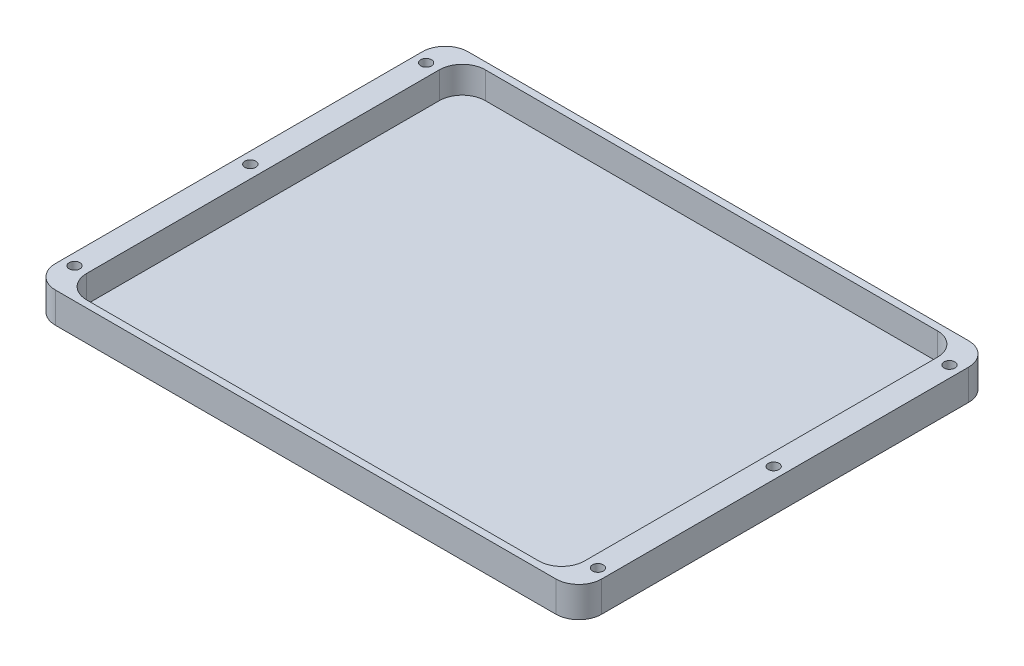
ISO-10303-21;
HEADER;
FILE_DESCRIPTION(('STEP AP214'),'2;1');
FILE_NAME('part.step','',(''),(''),'','','');
FILE_SCHEMA(('AUTOMOTIVE_DESIGN { 1 0 10303 214 1 1 1 1 }'));
ENDSEC;
DATA;
#1=APPLICATION_CONTEXT('core data for automotive mechanical design processes');
#2=APPLICATION_PROTOCOL_DEFINITION('international standard','automotive_design',2000,#1);
#3=PRODUCT_CONTEXT('',#1,'mechanical');
#4=PRODUCT('Part','Part','',(#3));
#5=PRODUCT_RELATED_PRODUCT_CATEGORY('part','',(#4));
#6=PRODUCT_DEFINITION_FORMATION('','',#4);
#7=PRODUCT_DEFINITION_CONTEXT('part definition',#1,'design');
#8=PRODUCT_DEFINITION('design','',#6,#7);
#9=PRODUCT_DEFINITION_SHAPE('','',#8);
#10=(LENGTH_UNIT() NAMED_UNIT(*) SI_UNIT(.MILLI.,.METRE.));
#11=(NAMED_UNIT(*) PLANE_ANGLE_UNIT() SI_UNIT($,.RADIAN.));
#12=(NAMED_UNIT(*) SI_UNIT($,.STERADIAN.) SOLID_ANGLE_UNIT());
#13=UNCERTAINTY_MEASURE_WITH_UNIT(LENGTH_MEASURE(1.E-05),#10,'distance_accuracy_value','');
#14=(GEOMETRIC_REPRESENTATION_CONTEXT(3) GLOBAL_UNCERTAINTY_ASSIGNED_CONTEXT((#13)) GLOBAL_UNIT_ASSIGNED_CONTEXT((#10,
#11,#12)) REPRESENTATION_CONTEXT('',''));
#15=CARTESIAN_POINT('',(0.,0.,0.));
#16=DIRECTION('',(0.,0.,1.));
#17=DIRECTION('',(1.,0.,0.));
#18=AXIS2_PLACEMENT_3D('',#15,#16,#17);
#19=CARTESIAN_POINT('',(0.,12.7,0.));
#20=DIRECTION('',(1.,0.,0.));
#21=DIRECTION('',(0.,0.,-1.));
#22=AXIS2_PLACEMENT_3D('',#19,#20,#21);
#23=PLANE('',#22);
#24=DIRECTION('',(0.,0.,1.));
#25=VECTOR('',#24,1.);
#26=CARTESIAN_POINT('',(0.,12.7,0.));
#27=LINE('',#26,#25);
#28=CARTESIAN_POINT('',(0.,12.7,-161.925));
#29=VERTEX_POINT('',#28);
#30=CARTESIAN_POINT('',(0.,12.7,-9.525));
#31=VERTEX_POINT('',#30);
#32=EDGE_CURVE('E223',#29,#31,#27,.T.);
#33=ORIENTED_EDGE('',*,*,#32,.F.);
#34=DIRECTION('',(0.,-1.,0.));
#35=VECTOR('',#34,1.);
#36=CARTESIAN_POINT('',(0.,12.7,-161.925));
#37=LINE('',#36,#35);
#38=CARTESIAN_POINT('',(0.,0.,-161.925));
#39=VERTEX_POINT('',#38);
#40=EDGE_CURVE('E245',#29,#39,#37,.T.);
#41=ORIENTED_EDGE('',*,*,#40,.T.);
#42=DIRECTION('',(0.,0.,1.));
#43=VECTOR('',#42,1.);
#44=CARTESIAN_POINT('',(0.,0.,0.));
#45=LINE('',#44,#43);
#46=CARTESIAN_POINT('',(0.,0.,-9.525));
#47=VERTEX_POINT('',#46);
#48=EDGE_CURVE('E211',#39,#47,#45,.T.);
#49=ORIENTED_EDGE('',*,*,#48,.T.);
#50=DIRECTION('',(0.,-1.,0.));
#51=VECTOR('',#50,1.);
#52=CARTESIAN_POINT('',(0.,12.7,-9.525));
#53=LINE('',#52,#51);
#54=EDGE_CURVE('E234',#47,#31,#53,.F.);
#55=ORIENTED_EDGE('',*,*,#54,.T.);
#56=EDGE_LOOP('',(#33,#41,#49,#55));
#57=FACE_BOUND('',#56,.T.);
#58=ADVANCED_FACE('F31',(#57),#23,.F.);
#59=CARTESIAN_POINT('',(0.,12.7,0.));
#60=DIRECTION('',(0.,0.,-1.));
#61=DIRECTION('',(-1.,0.,0.));
#62=AXIS2_PLACEMENT_3D('',#59,#60,#61);
#63=PLANE('',#62);
#64=DIRECTION('',(1.,0.,0.));
#65=VECTOR('',#64,1.);
#66=CARTESIAN_POINT('',(0.,12.7,0.));
#67=LINE('',#66,#65);
#68=CARTESIAN_POINT('',(9.525,12.7,0.));
#69=VERTEX_POINT('',#68);
#70=CARTESIAN_POINT('',(217.424,12.7,0.));
#71=VERTEX_POINT('',#70);
#72=EDGE_CURVE('E226',#69,#71,#67,.T.);
#73=ORIENTED_EDGE('',*,*,#72,.F.);
#74=DIRECTION('',(0.,-1.,0.));
#75=VECTOR('',#74,1.);
#76=CARTESIAN_POINT('',(9.525,12.7,0.));
#77=LINE('',#76,#75);
#78=CARTESIAN_POINT('',(9.525,0.,0.));
#79=VERTEX_POINT('',#78);
#80=EDGE_CURVE('E270',#69,#79,#77,.T.);
#81=ORIENTED_EDGE('',*,*,#80,.T.);
#82=DIRECTION('',(1.,0.,0.));
#83=VECTOR('',#82,1.);
#84=CARTESIAN_POINT('',(0.,0.,0.));
#85=LINE('',#84,#83);
#86=CARTESIAN_POINT('',(217.424,0.,0.));
#87=VERTEX_POINT('',#86);
#88=EDGE_CURVE('E237',#79,#87,#85,.T.);
#89=ORIENTED_EDGE('',*,*,#88,.T.);
#90=DIRECTION('',(0.,-1.,0.));
#91=VECTOR('',#90,1.);
#92=CARTESIAN_POINT('',(217.424,12.7,0.));
#93=LINE('',#92,#91);
#94=EDGE_CURVE('E268',#87,#71,#93,.F.);
#95=ORIENTED_EDGE('',*,*,#94,.T.);
#96=EDGE_LOOP('',(#73,#81,#89,#95));
#97=FACE_BOUND('',#96,.T.);
#98=ADVANCED_FACE('F276',(#97),#63,.F.);
#99=CARTESIAN_POINT('',(226.949,12.7,0.));
#100=DIRECTION('',(-1.,0.,0.));
#101=DIRECTION('',(0.,0.,1.));
#102=AXIS2_PLACEMENT_3D('',#99,#100,#101);
#103=PLANE('',#102);
#104=DIRECTION('',(0.,0.,-1.));
#105=VECTOR('',#104,1.);
#106=CARTESIAN_POINT('',(226.949,12.7,0.));
#107=LINE('',#106,#105);
#108=CARTESIAN_POINT('',(226.949,12.7,-9.525));
#109=VERTEX_POINT('',#108);
#110=CARTESIAN_POINT('',(226.949,12.7,-161.925));
#111=VERTEX_POINT('',#110);
#112=EDGE_CURVE('E229',#109,#111,#107,.T.);
#113=ORIENTED_EDGE('',*,*,#112,.F.);
#114=DIRECTION('',(0.,-1.,0.));
#115=VECTOR('',#114,1.);
#116=CARTESIAN_POINT('',(226.949,12.7,-9.525));
#117=LINE('',#116,#115);
#118=CARTESIAN_POINT('',(226.949,0.,-9.525));
#119=VERTEX_POINT('',#118);
#120=EDGE_CURVE('E11',#109,#119,#117,.T.);
#121=ORIENTED_EDGE('',*,*,#120,.T.);
#122=DIRECTION('',(0.,0.,-1.));
#123=VECTOR('',#122,1.);
#124=CARTESIAN_POINT('',(226.949,0.,0.));
#125=LINE('',#124,#123);
#126=CARTESIAN_POINT('',(226.949,0.,-161.925));
#127=VERTEX_POINT('',#126);
#128=EDGE_CURVE('E240',#119,#127,#125,.T.);
#129=ORIENTED_EDGE('',*,*,#128,.T.);
#130=DIRECTION('',(0.,-1.,0.));
#131=VECTOR('',#130,1.);
#132=CARTESIAN_POINT('',(226.949,12.7,-161.925));
#133=LINE('',#132,#131);
#134=EDGE_CURVE('E39',#127,#111,#133,.F.);
#135=ORIENTED_EDGE('',*,*,#134,.T.);
#136=EDGE_LOOP('',(#113,#121,#129,#135));
#137=FACE_BOUND('',#136,.T.);
#138=ADVANCED_FACE('F287',(#137),#103,.F.);
#139=CARTESIAN_POINT('',(0.,12.7,-171.45));
#140=DIRECTION('',(0.,0.,1.));
#141=DIRECTION('',(1.,0.,0.));
#142=AXIS2_PLACEMENT_3D('',#139,#140,#141);
#143=PLANE('',#142);
#144=DIRECTION('',(-1.,0.,0.));
#145=VECTOR('',#144,1.);
#146=CARTESIAN_POINT('',(0.,0.,-171.45));
#147=LINE('',#146,#145);
#148=CARTESIAN_POINT('',(217.424,0.,-171.45));
#149=VERTEX_POINT('',#148);
#150=CARTESIAN_POINT('',(9.525,0.,-171.45));
#151=VERTEX_POINT('',#150);
#152=EDGE_CURVE('E227',#149,#151,#147,.T.);
#153=ORIENTED_EDGE('',*,*,#152,.T.);
#154=DIRECTION('',(0.,-1.,0.));
#155=VECTOR('',#154,1.);
#156=CARTESIAN_POINT('',(9.525,12.7,-171.45));
#157=LINE('',#156,#155);
#158=CARTESIAN_POINT('',(9.525,12.7,-171.45));
#159=VERTEX_POINT('',#158);
#160=EDGE_CURVE('E259',#151,#159,#157,.F.);
#161=ORIENTED_EDGE('',*,*,#160,.T.);
#162=DIRECTION('',(-1.,0.,0.));
#163=VECTOR('',#162,1.);
#164=CARTESIAN_POINT('',(0.,12.7,-171.45));
#165=LINE('',#164,#163);
#166=CARTESIAN_POINT('',(217.424,12.7,-171.45));
#167=VERTEX_POINT('',#166);
#168=EDGE_CURVE('E231',#167,#159,#165,.T.);
#169=ORIENTED_EDGE('',*,*,#168,.F.);
#170=DIRECTION('',(0.,-1.,0.));
#171=VECTOR('',#170,1.);
#172=CARTESIAN_POINT('',(217.424,12.7,-171.45));
#173=LINE('',#172,#171);
#174=EDGE_CURVE('E256',#167,#149,#173,.T.);
#175=ORIENTED_EDGE('',*,*,#174,.T.);
#176=EDGE_LOOP('',(#153,#161,#169,#175));
#177=FACE_BOUND('',#176,.T.);
#178=ADVANCED_FACE('F295',(#177),#143,.F.);
#179=CARTESIAN_POINT('',(0.,12.7,-171.45));
#180=DIRECTION('',(0.,-1.,0.));
#181=DIRECTION('',(0.,0.,-1.));
#182=AXIS2_PLACEMENT_3D('',#179,#180,#181);
#183=PLANE('',#182);
#184=CARTESIAN_POINT('',(222.1865,12.7,-12.7));
#185=DIRECTION('',(0.,-1.,0.));
#186=DIRECTION('',(0.,0.,-1.));
#187=AXIS2_PLACEMENT_3D('',#184,#185,#186);
#188=CIRCLE('',#187,2.2479);
#189=CARTESIAN_POINT('',(222.1865,12.7,-14.9479));
#190=VERTEX_POINT('',#189);
#191=EDGE_CURVE('E416',#190,#190,#188,.T.);
#192=ORIENTED_EDGE('',*,*,#191,.T.);
#193=EDGE_LOOP('',(#192));
#194=FACE_BOUND('',#193,.T.);
#195=CARTESIAN_POINT('',(222.1865,12.7,-158.75));
#196=DIRECTION('',(0.,-1.,0.));
#197=DIRECTION('',(0.,0.,-1.));
#198=AXIS2_PLACEMENT_3D('',#195,#196,#197);
#199=CIRCLE('',#198,2.2479);
#200=CARTESIAN_POINT('',(222.1865,12.7,-160.9979));
#201=VERTEX_POINT('',#200);
#202=EDGE_CURVE('E427',#201,#201,#199,.T.);
#203=ORIENTED_EDGE('',*,*,#202,.T.);
#204=EDGE_LOOP('',(#203));
#205=FACE_BOUND('',#204,.T.);
#206=CARTESIAN_POINT('',(222.1865,12.7,-85.725));
#207=DIRECTION('',(0.,-1.,0.));
#208=DIRECTION('',(0.,0.,-1.));
#209=AXIS2_PLACEMENT_3D('',#206,#207,#208);
#210=CIRCLE('',#209,2.2479);
#211=CARTESIAN_POINT('',(222.1865,12.7,-87.9729));
#212=VERTEX_POINT('',#211);
#213=EDGE_CURVE('E436',#212,#212,#210,.T.);
#214=ORIENTED_EDGE('',*,*,#213,.T.);
#215=EDGE_LOOP('',(#214));
#216=FACE_BOUND('',#215,.T.);
#217=CARTESIAN_POINT('',(4.7625,12.7,-12.7));
#218=DIRECTION('',(0.,-1.,0.));
#219=DIRECTION('',(0.,0.,-1.));
#220=AXIS2_PLACEMENT_3D('',#217,#218,#219);
#221=CIRCLE('',#220,2.2479);
#222=CARTESIAN_POINT('',(4.7625,12.7,-14.9479));
#223=VERTEX_POINT('',#222);
#224=EDGE_CURVE('E445',#223,#223,#221,.T.);
#225=ORIENTED_EDGE('',*,*,#224,.T.);
#226=EDGE_LOOP('',(#225));
#227=FACE_BOUND('',#226,.T.);
#228=CARTESIAN_POINT('',(4.76250000000003,12.7,-158.75));
#229=DIRECTION('',(0.,-1.,0.));
#230=DIRECTION('',(0.,0.,-1.));
#231=AXIS2_PLACEMENT_3D('',#228,#229,#230);
#232=CIRCLE('',#231,2.2479);
#233=CARTESIAN_POINT('',(4.76250000000003,12.7,-160.9979));
#234=VERTEX_POINT('',#233);
#235=EDGE_CURVE('E454',#234,#234,#232,.T.);
#236=ORIENTED_EDGE('',*,*,#235,.T.);
#237=EDGE_LOOP('',(#236));
#238=FACE_BOUND('',#237,.T.);
#239=CARTESIAN_POINT('',(4.76250000000002,12.7,-85.725));
#240=DIRECTION('',(0.,-1.,0.));
#241=DIRECTION('',(0.,0.,-1.));
#242=AXIS2_PLACEMENT_3D('',#239,#240,#241);
#243=CIRCLE('',#242,2.2479);
#244=CARTESIAN_POINT('',(4.76250000000002,12.7,-87.9729));
#245=VERTEX_POINT('',#244);
#246=EDGE_CURVE('E176',#245,#245,#243,.T.);
#247=ORIENTED_EDGE('',*,*,#246,.T.);
#248=EDGE_LOOP('',(#247));
#249=FACE_BOUND('',#248,.T.);
#250=DIRECTION('',(-1.,0.,0.));
#251=VECTOR('',#250,1.);
#252=CARTESIAN_POINT('',(19.558,12.7,-168.529));
#253=LINE('',#252,#251);
#254=CARTESIAN_POINT('',(207.391,12.7,-168.529));
#255=VERTEX_POINT('',#254);
#256=CARTESIAN_POINT('',(19.558,12.7,-168.529));
#257=VERTEX_POINT('',#256);
#258=EDGE_CURVE('E193',#255,#257,#253,.T.);
#259=ORIENTED_EDGE('',*,*,#258,.F.);
#260=CARTESIAN_POINT('',(207.391,12.7,-159.004));
#261=DIRECTION('',(0.,1.,0.));
#262=DIRECTION('',(0.,0.,-1.));
#263=AXIS2_PLACEMENT_3D('',#260,#261,#262);
#264=CIRCLE('',#263,9.52500000000001);
#265=CARTESIAN_POINT('',(216.916,12.7,-159.004));
#266=VERTEX_POINT('',#265);
#267=EDGE_CURVE('E152',#266,#255,#264,.T.);
#268=ORIENTED_EDGE('',*,*,#267,.F.);
#269=DIRECTION('',(0.,0.,-1.));
#270=VECTOR('',#269,1.);
#271=CARTESIAN_POINT('',(216.916,12.7,-12.446));
#272=LINE('',#271,#270);
#273=CARTESIAN_POINT('',(216.916,12.7,-12.446));
#274=VERTEX_POINT('',#273);
#275=EDGE_CURVE('E170',#274,#266,#272,.T.);
#276=ORIENTED_EDGE('',*,*,#275,.F.);
#277=CARTESIAN_POINT('',(207.391,12.7,-12.446));
#278=DIRECTION('',(0.,1.,0.));
#279=DIRECTION('',(0.,0.,1.));
#280=AXIS2_PLACEMENT_3D('',#277,#278,#279);
#281=CIRCLE('',#280,9.525);
#282=CARTESIAN_POINT('',(207.391,12.7,-2.92100000000001));
#283=VERTEX_POINT('',#282);
#284=EDGE_CURVE('E173',#283,#274,#281,.T.);
#285=ORIENTED_EDGE('',*,*,#284,.F.);
#286=DIRECTION('',(1.,0.,0.));
#287=VECTOR('',#286,1.);
#288=CARTESIAN_POINT('',(19.558,12.7,-2.92100000000001));
#289=LINE('',#288,#287);
#290=CARTESIAN_POINT('',(19.558,12.7,-2.92100000000001));
#291=VERTEX_POINT('',#290);
#292=EDGE_CURVE('E204',#291,#283,#289,.T.);
#293=ORIENTED_EDGE('',*,*,#292,.F.);
#294=CARTESIAN_POINT('',(19.558,12.7,-12.446));
#295=DIRECTION('',(0.,1.,0.));
#296=DIRECTION('',(0.,0.,-1.));
#297=AXIS2_PLACEMENT_3D('',#294,#295,#296);
#298=CIRCLE('',#297,9.525);
#299=CARTESIAN_POINT('',(10.033,12.7,-12.446));
#300=VERTEX_POINT('',#299);
#301=EDGE_CURVE('E201',#300,#291,#298,.T.);
#302=ORIENTED_EDGE('',*,*,#301,.F.);
#303=DIRECTION('',(0.,0.,1.));
#304=VECTOR('',#303,1.);
#305=CARTESIAN_POINT('',(10.033,12.7,-12.446));
#306=LINE('',#305,#304);
#307=CARTESIAN_POINT('',(10.033,12.7,-159.004));
#308=VERTEX_POINT('',#307);
#309=EDGE_CURVE('E198',#308,#300,#306,.T.);
#310=ORIENTED_EDGE('',*,*,#309,.F.);
#311=CARTESIAN_POINT('',(19.558,12.7,-159.004));
#312=DIRECTION('',(0.,1.,0.));
#313=DIRECTION('',(0.,0.,-1.));
#314=AXIS2_PLACEMENT_3D('',#311,#312,#313);
#315=CIRCLE('',#314,9.525);
#316=EDGE_CURVE('E195',#257,#308,#315,.T.);
#317=ORIENTED_EDGE('',*,*,#316,.F.);
#318=EDGE_LOOP('',(#259,#268,#276,#285,#293,#302,#310,#317));
#319=FACE_BOUND('',#318,.T.);
#320=ORIENTED_EDGE('',*,*,#168,.T.);
#321=CARTESIAN_POINT('',(9.525,12.7,-161.925));
#322=DIRECTION('',(0.,-1.,0.));
#323=DIRECTION('',(0.,0.,-1.));
#324=AXIS2_PLACEMENT_3D('',#321,#322,#323);
#325=CIRCLE('',#324,9.525);
#326=EDGE_CURVE('E266',#159,#29,#325,.F.);
#327=ORIENTED_EDGE('',*,*,#326,.T.);
#328=ORIENTED_EDGE('',*,*,#32,.T.);
#329=CARTESIAN_POINT('',(9.525,12.7,-9.525));
#330=DIRECTION('',(0.,-1.,0.));
#331=DIRECTION('',(0.,0.,-1.));
#332=AXIS2_PLACEMENT_3D('',#329,#330,#331);
#333=CIRCLE('',#332,9.525);
#334=EDGE_CURVE('E264',#31,#69,#333,.F.);
#335=ORIENTED_EDGE('',*,*,#334,.T.);
#336=ORIENTED_EDGE('',*,*,#72,.T.);
#337=CARTESIAN_POINT('',(217.424,12.7,-9.525));
#338=DIRECTION('',(0.,-1.,0.));
#339=DIRECTION('',(0.,0.,-1.));
#340=AXIS2_PLACEMENT_3D('',#337,#338,#339);
#341=CIRCLE('',#340,9.525);
#342=EDGE_CURVE('E52',#71,#109,#341,.F.);
#343=ORIENTED_EDGE('',*,*,#342,.T.);
#344=ORIENTED_EDGE('',*,*,#112,.T.);
#345=CARTESIAN_POINT('',(217.424,12.7,-161.925));
#346=DIRECTION('',(0.,-1.,0.));
#347=DIRECTION('',(0.,0.,-1.));
#348=AXIS2_PLACEMENT_3D('',#345,#346,#347);
#349=CIRCLE('',#348,9.525);
#350=EDGE_CURVE('E261',#111,#167,#349,.F.);
#351=ORIENTED_EDGE('',*,*,#350,.T.);
#352=EDGE_LOOP('',(#320,#327,#328,#335,#336,#343,#344,#351));
#353=FACE_BOUND('',#352,.T.);
#354=ADVANCED_FACE('F289',(#194,#205,#216,#227,#238,#249,#319,#353),#183,.F.);
#355=CARTESIAN_POINT('',(0.,0.,-171.45));
#356=DIRECTION('',(0.,-1.,0.));
#357=DIRECTION('',(0.,0.,-1.));
#358=AXIS2_PLACEMENT_3D('',#355,#356,#357);
#359=PLANE('',#358);
#360=CARTESIAN_POINT('',(222.1865,0.,-12.7));
#361=DIRECTION('',(0.,-1.,0.));
#362=DIRECTION('',(0.,0.,-1.));
#363=AXIS2_PLACEMENT_3D('',#360,#361,#362);
#364=CIRCLE('',#363,4.55929999999999);
#365=CARTESIAN_POINT('',(222.1865,0.,-17.2593));
#366=VERTEX_POINT('',#365);
#367=EDGE_CURVE('E414',#366,#366,#364,.T.);
#368=ORIENTED_EDGE('',*,*,#367,.F.);
#369=EDGE_LOOP('',(#368));
#370=FACE_BOUND('',#369,.T.);
#371=CARTESIAN_POINT('',(222.1865,0.,-158.75));
#372=DIRECTION('',(0.,-1.,0.));
#373=DIRECTION('',(0.,0.,-1.));
#374=AXIS2_PLACEMENT_3D('',#371,#372,#373);
#375=CIRCLE('',#374,4.55929999999999);
#376=CARTESIAN_POINT('',(222.1865,0.,-163.3093));
#377=VERTEX_POINT('',#376);
#378=EDGE_CURVE('E421',#377,#377,#375,.T.);
#379=ORIENTED_EDGE('',*,*,#378,.F.);
#380=EDGE_LOOP('',(#379));
#381=FACE_BOUND('',#380,.T.);
#382=CARTESIAN_POINT('',(222.1865,0.,-85.725));
#383=DIRECTION('',(0.,-1.,0.));
#384=DIRECTION('',(0.,0.,-1.));
#385=AXIS2_PLACEMENT_3D('',#382,#383,#384);
#386=CIRCLE('',#385,4.55929999999999);
#387=CARTESIAN_POINT('',(222.1865,0.,-90.2843));
#388=VERTEX_POINT('',#387);
#389=EDGE_CURVE('E430',#388,#388,#386,.T.);
#390=ORIENTED_EDGE('',*,*,#389,.F.);
#391=EDGE_LOOP('',(#390));
#392=FACE_BOUND('',#391,.T.);
#393=CARTESIAN_POINT('',(4.7625,0.,-12.7));
#394=DIRECTION('',(0.,-1.,0.));
#395=DIRECTION('',(0.,0.,-1.));
#396=AXIS2_PLACEMENT_3D('',#393,#394,#395);
#397=CIRCLE('',#396,4.5593);
#398=CARTESIAN_POINT('',(4.7625,0.,-17.2593));
#399=VERTEX_POINT('',#398);
#400=EDGE_CURVE('E439',#399,#399,#397,.T.);
#401=ORIENTED_EDGE('',*,*,#400,.F.);
#402=EDGE_LOOP('',(#401));
#403=FACE_BOUND('',#402,.T.);
#404=CARTESIAN_POINT('',(4.76250000000003,0.,-158.75));
#405=DIRECTION('',(0.,-1.,0.));
#406=DIRECTION('',(0.,0.,-1.));
#407=AXIS2_PLACEMENT_3D('',#404,#405,#406);
#408=CIRCLE('',#407,4.5593);
#409=CARTESIAN_POINT('',(4.76250000000003,0.,-163.3093));
#410=VERTEX_POINT('',#409);
#411=EDGE_CURVE('E448',#410,#410,#408,.T.);
#412=ORIENTED_EDGE('',*,*,#411,.F.);
#413=EDGE_LOOP('',(#412));
#414=FACE_BOUND('',#413,.T.);
#415=CARTESIAN_POINT('',(4.76250000000002,0.,-85.725));
#416=DIRECTION('',(0.,-1.,0.));
#417=DIRECTION('',(0.,0.,-1.));
#418=AXIS2_PLACEMENT_3D('',#415,#416,#417);
#419=CIRCLE('',#418,4.5593);
#420=CARTESIAN_POINT('',(4.76250000000002,0.,-90.2843));
#421=VERTEX_POINT('',#420);
#422=EDGE_CURVE('E457',#421,#421,#419,.T.);
#423=ORIENTED_EDGE('',*,*,#422,.F.);
#424=EDGE_LOOP('',(#423));
#425=FACE_BOUND('',#424,.T.);
#426=ORIENTED_EDGE('',*,*,#48,.F.);
#427=CARTESIAN_POINT('',(9.525,0.,-161.925));
#428=DIRECTION('',(0.,-1.,0.));
#429=DIRECTION('',(0.,0.,-1.));
#430=AXIS2_PLACEMENT_3D('',#427,#428,#429);
#431=CIRCLE('',#430,9.525);
#432=EDGE_CURVE('E254',#39,#151,#431,.T.);
#433=ORIENTED_EDGE('',*,*,#432,.T.);
#434=ORIENTED_EDGE('',*,*,#152,.F.);
#435=CARTESIAN_POINT('',(217.424,0.,-161.925));
#436=DIRECTION('',(0.,-1.,0.));
#437=DIRECTION('',(0.,0.,-1.));
#438=AXIS2_PLACEMENT_3D('',#435,#436,#437);
#439=CIRCLE('',#438,9.525);
#440=EDGE_CURVE('E248',#149,#127,#439,.T.);
#441=ORIENTED_EDGE('',*,*,#440,.T.);
#442=ORIENTED_EDGE('',*,*,#128,.F.);
#443=CARTESIAN_POINT('',(217.424,0.,-9.525));
#444=DIRECTION('',(0.,-1.,0.));
#445=DIRECTION('',(0.,0.,-1.));
#446=AXIS2_PLACEMENT_3D('',#443,#444,#445);
#447=CIRCLE('',#446,9.525);
#448=EDGE_CURVE('E250',#119,#87,#447,.T.);
#449=ORIENTED_EDGE('',*,*,#448,.T.);
#450=ORIENTED_EDGE('',*,*,#88,.F.);
#451=CARTESIAN_POINT('',(9.525,0.,-9.525));
#452=DIRECTION('',(0.,-1.,0.));
#453=DIRECTION('',(0.,0.,-1.));
#454=AXIS2_PLACEMENT_3D('',#451,#452,#453);
#455=CIRCLE('',#454,9.525);
#456=EDGE_CURVE('E252',#79,#47,#455,.T.);
#457=ORIENTED_EDGE('',*,*,#456,.T.);
#458=EDGE_LOOP('',(#426,#433,#434,#441,#442,#449,#450,#457));
#459=FACE_BOUND('',#458,.T.);
#460=ADVANCED_FACE('F282',(#370,#381,#392,#403,#414,#425,#459),#359,.T.);
#461=CARTESIAN_POINT('',(207.391,1.5875,-159.004));
#462=DIRECTION('',(0.,1.,0.));
#463=DIRECTION('',(0.,0.,1.));
#464=AXIS2_PLACEMENT_3D('',#461,#462,#463);
#465=CYLINDRICAL_SURFACE('',#464,9.52500000000001);
#466=ORIENTED_EDGE('',*,*,#267,.T.);
#467=DIRECTION('',(0.,1.,0.));
#468=VECTOR('',#467,1.);
#469=CARTESIAN_POINT('',(207.391,1.5875,-168.529));
#470=LINE('',#469,#468);
#471=CARTESIAN_POINT('',(207.391,1.5875,-168.529));
#472=VERTEX_POINT('',#471);
#473=EDGE_CURVE('E145',#472,#255,#470,.T.);
#474=ORIENTED_EDGE('',*,*,#473,.F.);
#475=CARTESIAN_POINT('',(207.391,1.5875,-159.004));
#476=DIRECTION('',(0.,1.,0.));
#477=DIRECTION('',(0.,0.,-1.));
#478=AXIS2_PLACEMENT_3D('',#475,#476,#477);
#479=CIRCLE('',#478,9.52500000000001);
#480=CARTESIAN_POINT('',(216.916,1.5875,-159.004));
#481=VERTEX_POINT('',#480);
#482=EDGE_CURVE('E149',#481,#472,#479,.T.);
#483=ORIENTED_EDGE('',*,*,#482,.F.);
#484=DIRECTION('',(0.,1.,0.));
#485=VECTOR('',#484,1.);
#486=CARTESIAN_POINT('',(216.916,1.5875,-159.004));
#487=LINE('',#486,#485);
#488=EDGE_CURVE('E209',#481,#266,#487,.T.);
#489=ORIENTED_EDGE('',*,*,#488,.T.);
#490=EDGE_LOOP('',(#466,#474,#483,#489));
#491=FACE_BOUND('',#490,.T.);
#492=ADVANCED_FACE('F147',(#491),#465,.F.);
#493=CARTESIAN_POINT('',(216.916,1.5875,-12.446));
#494=DIRECTION('',(1.,0.,0.));
#495=DIRECTION('',(0.,0.,-1.));
#496=AXIS2_PLACEMENT_3D('',#493,#494,#495);
#497=PLANE('',#496);
#498=ORIENTED_EDGE('',*,*,#275,.T.);
#499=ORIENTED_EDGE('',*,*,#488,.F.);
#500=DIRECTION('',(0.,0.,-1.));
#501=VECTOR('',#500,1.);
#502=CARTESIAN_POINT('',(216.916,1.5875,-12.446));
#503=LINE('',#502,#501);
#504=CARTESIAN_POINT('',(216.916,1.5875,-12.446));
#505=VERTEX_POINT('',#504);
#506=EDGE_CURVE('E157',#505,#481,#503,.T.);
#507=ORIENTED_EDGE('',*,*,#506,.F.);
#508=DIRECTION('',(0.,1.,0.));
#509=VECTOR('',#508,1.);
#510=CARTESIAN_POINT('',(216.916,1.5875,-12.446));
#511=LINE('',#510,#509);
#512=EDGE_CURVE('E212',#505,#274,#511,.T.);
#513=ORIENTED_EDGE('',*,*,#512,.T.);
#514=EDGE_LOOP('',(#498,#499,#507,#513));
#515=FACE_BOUND('',#514,.T.);
#516=ADVANCED_FACE('F332',(#515),#497,.F.);
#517=CARTESIAN_POINT('',(207.391,1.5875,-12.446));
#518=DIRECTION('',(0.,1.,0.));
#519=DIRECTION('',(0.,0.,1.));
#520=AXIS2_PLACEMENT_3D('',#517,#518,#519);
#521=CYLINDRICAL_SURFACE('',#520,9.525);
#522=ORIENTED_EDGE('',*,*,#284,.T.);
#523=ORIENTED_EDGE('',*,*,#512,.F.);
#524=CARTESIAN_POINT('',(207.391,1.5875,-12.446));
#525=DIRECTION('',(0.,1.,0.));
#526=DIRECTION('',(0.,0.,1.));
#527=AXIS2_PLACEMENT_3D('',#524,#525,#526);
#528=CIRCLE('',#527,9.525);
#529=CARTESIAN_POINT('',(207.391,1.5875,-2.92100000000001));
#530=VERTEX_POINT('',#529);
#531=EDGE_CURVE('E189',#530,#505,#528,.T.);
#532=ORIENTED_EDGE('',*,*,#531,.F.);
#533=DIRECTION('',(0.,1.,0.));
#534=VECTOR('',#533,1.);
#535=CARTESIAN_POINT('',(207.391,1.5875,-2.92100000000001));
#536=LINE('',#535,#534);
#537=EDGE_CURVE('E214',#530,#283,#536,.T.);
#538=ORIENTED_EDGE('',*,*,#537,.T.);
#539=EDGE_LOOP('',(#522,#523,#532,#538));
#540=FACE_BOUND('',#539,.T.);
#541=ADVANCED_FACE('F350',(#540),#521,.F.);
#542=CARTESIAN_POINT('',(19.558,1.5875,-2.92100000000001));
#543=DIRECTION('',(0.,0.,1.));
#544=DIRECTION('',(1.,0.,0.));
#545=AXIS2_PLACEMENT_3D('',#542,#543,#544);
#546=PLANE('',#545);
#547=ORIENTED_EDGE('',*,*,#292,.T.);
#548=ORIENTED_EDGE('',*,*,#537,.F.);
#549=DIRECTION('',(1.,0.,0.));
#550=VECTOR('',#549,1.);
#551=CARTESIAN_POINT('',(19.558,1.5875,-2.92100000000001));
#552=LINE('',#551,#550);
#553=CARTESIAN_POINT('',(19.558,1.5875,-2.92100000000001));
#554=VERTEX_POINT('',#553);
#555=EDGE_CURVE('E186',#554,#530,#552,.T.);
#556=ORIENTED_EDGE('',*,*,#555,.F.);
#557=DIRECTION('',(0.,1.,0.));
#558=VECTOR('',#557,1.);
#559=CARTESIAN_POINT('',(19.558,1.5875,-2.92100000000001));
#560=LINE('',#559,#558);
#561=EDGE_CURVE('E216',#554,#291,#560,.T.);
#562=ORIENTED_EDGE('',*,*,#561,.T.);
#563=EDGE_LOOP('',(#547,#548,#556,#562));
#564=FACE_BOUND('',#563,.T.);
#565=ADVANCED_FACE('F346',(#564),#546,.F.);
#566=CARTESIAN_POINT('',(19.558,1.5875,-12.446));
#567=DIRECTION('',(0.,1.,0.));
#568=DIRECTION('',(0.,0.,1.));
#569=AXIS2_PLACEMENT_3D('',#566,#567,#568);
#570=CYLINDRICAL_SURFACE('',#569,9.525);
#571=ORIENTED_EDGE('',*,*,#301,.T.);
#572=ORIENTED_EDGE('',*,*,#561,.F.);
#573=CARTESIAN_POINT('',(19.558,1.5875,-12.446));
#574=DIRECTION('',(0.,1.,0.));
#575=DIRECTION('',(0.,0.,-1.));
#576=AXIS2_PLACEMENT_3D('',#573,#574,#575);
#577=CIRCLE('',#576,9.525);
#578=CARTESIAN_POINT('',(10.033,1.5875,-12.446));
#579=VERTEX_POINT('',#578);
#580=EDGE_CURVE('E183',#579,#554,#577,.T.);
#581=ORIENTED_EDGE('',*,*,#580,.F.);
#582=DIRECTION('',(0.,1.,0.));
#583=VECTOR('',#582,1.);
#584=CARTESIAN_POINT('',(10.033,1.5875,-12.446));
#585=LINE('',#584,#583);
#586=EDGE_CURVE('E218',#579,#300,#585,.T.);
#587=ORIENTED_EDGE('',*,*,#586,.T.);
#588=EDGE_LOOP('',(#571,#572,#581,#587));
#589=FACE_BOUND('',#588,.T.);
#590=ADVANCED_FACE('F342',(#589),#570,.F.);
#591=CARTESIAN_POINT('',(10.033,1.5875,-12.446));
#592=DIRECTION('',(-1.,0.,0.));
#593=DIRECTION('',(0.,0.,1.));
#594=AXIS2_PLACEMENT_3D('',#591,#592,#593);
#595=PLANE('',#594);
#596=ORIENTED_EDGE('',*,*,#309,.T.);
#597=ORIENTED_EDGE('',*,*,#586,.F.);
#598=DIRECTION('',(0.,0.,1.));
#599=VECTOR('',#598,1.);
#600=CARTESIAN_POINT('',(10.033,1.5875,-12.446));
#601=LINE('',#600,#599);
#602=CARTESIAN_POINT('',(10.033,1.5875,-159.004));
#603=VERTEX_POINT('',#602);
#604=EDGE_CURVE('E180',#603,#579,#601,.T.);
#605=ORIENTED_EDGE('',*,*,#604,.F.);
#606=DIRECTION('',(0.,1.,0.));
#607=VECTOR('',#606,1.);
#608=CARTESIAN_POINT('',(10.033,1.5875,-159.004));
#609=LINE('',#608,#607);
#610=EDGE_CURVE('E220',#603,#308,#609,.T.);
#611=ORIENTED_EDGE('',*,*,#610,.T.);
#612=EDGE_LOOP('',(#596,#597,#605,#611));
#613=FACE_BOUND('',#612,.T.);
#614=ADVANCED_FACE('F338',(#613),#595,.F.);
#615=CARTESIAN_POINT('',(19.558,1.5875,-159.004));
#616=DIRECTION('',(0.,1.,0.));
#617=DIRECTION('',(0.,0.,1.));
#618=AXIS2_PLACEMENT_3D('',#615,#616,#617);
#619=CYLINDRICAL_SURFACE('',#618,9.525);
#620=ORIENTED_EDGE('',*,*,#316,.T.);
#621=ORIENTED_EDGE('',*,*,#610,.F.);
#622=CARTESIAN_POINT('',(19.558,1.5875,-159.004));
#623=DIRECTION('',(0.,1.,0.));
#624=DIRECTION('',(0.,0.,-1.));
#625=AXIS2_PLACEMENT_3D('',#622,#623,#624);
#626=CIRCLE('',#625,9.525);
#627=CARTESIAN_POINT('',(19.558,1.5875,-168.529));
#628=VERTEX_POINT('',#627);
#629=EDGE_CURVE('E165',#628,#603,#626,.T.);
#630=ORIENTED_EDGE('',*,*,#629,.F.);
#631=DIRECTION('',(0.,1.,0.));
#632=VECTOR('',#631,1.);
#633=CARTESIAN_POINT('',(19.558,1.5875,-168.529));
#634=LINE('',#633,#632);
#635=EDGE_CURVE('E156',#628,#257,#634,.T.);
#636=ORIENTED_EDGE('',*,*,#635,.T.);
#637=EDGE_LOOP('',(#620,#621,#630,#636));
#638=FACE_BOUND('',#637,.T.);
#639=ADVANCED_FACE('F335',(#638),#619,.F.);
#640=CARTESIAN_POINT('',(19.558,1.5875,-168.529));
#641=DIRECTION('',(0.,0.,-1.));
#642=DIRECTION('',(-1.,0.,0.));
#643=AXIS2_PLACEMENT_3D('',#640,#641,#642);
#644=PLANE('',#643);
#645=ORIENTED_EDGE('',*,*,#258,.T.);
#646=ORIENTED_EDGE('',*,*,#635,.F.);
#647=DIRECTION('',(-1.,0.,0.));
#648=VECTOR('',#647,1.);
#649=CARTESIAN_POINT('',(19.558,1.5875,-168.529));
#650=LINE('',#649,#648);
#651=EDGE_CURVE('E160',#472,#628,#650,.T.);
#652=ORIENTED_EDGE('',*,*,#651,.F.);
#653=ORIENTED_EDGE('',*,*,#473,.T.);
#654=EDGE_LOOP('',(#645,#646,#652,#653));
#655=FACE_BOUND('',#654,.T.);
#656=ADVANCED_FACE('F161',(#655),#644,.F.);
#657=CARTESIAN_POINT('',(207.391,1.5875,-159.004));
#658=DIRECTION('',(0.,-1.,0.));
#659=DIRECTION('',(0.,0.,-1.));
#660=AXIS2_PLACEMENT_3D('',#657,#658,#659);
#661=PLANE('',#660);
#662=ORIENTED_EDGE('',*,*,#482,.T.);
#663=ORIENTED_EDGE('',*,*,#651,.T.);
#664=ORIENTED_EDGE('',*,*,#629,.T.);
#665=ORIENTED_EDGE('',*,*,#604,.T.);
#666=ORIENTED_EDGE('',*,*,#580,.T.);
#667=ORIENTED_EDGE('',*,*,#555,.T.);
#668=ORIENTED_EDGE('',*,*,#531,.T.);
#669=ORIENTED_EDGE('',*,*,#506,.T.);
#670=EDGE_LOOP('',(#662,#663,#664,#665,#666,#667,#668,#669));
#671=FACE_BOUND('',#670,.T.);
#672=ADVANCED_FACE('F167',(#671),#661,.F.);
#673=CARTESIAN_POINT('',(4.76250000000002,0.,-85.725));
#674=DIRECTION('',(0.,-1.,0.));
#675=DIRECTION('',(0.,0.,-1.));
#676=AXIS2_PLACEMENT_3D('',#673,#674,#675);
#677=CYLINDRICAL_SURFACE('',#676,2.2479);
#678=ORIENTED_EDGE('',*,*,#246,.F.);
#679=EDGE_LOOP('',(#678));
#680=FACE_BOUND('',#679,.T.);
#681=CARTESIAN_POINT('',(4.76250000000002,2.65896153645064,-85.725));
#682=DIRECTION('',(0.,-1.,0.));
#683=DIRECTION('',(0.,0.,-1.));
#684=AXIS2_PLACEMENT_3D('',#681,#682,#683);
#685=CIRCLE('',#684,2.2479);
#686=CARTESIAN_POINT('',(4.76250000000002,2.65896153645064,-87.9729));
#687=VERTEX_POINT('',#686);
#688=EDGE_CURVE('E459',#687,#687,#685,.T.);
#689=ORIENTED_EDGE('',*,*,#688,.T.);
#690=EDGE_LOOP('',(#689));
#691=FACE_BOUND('',#690,.T.);
#692=ADVANCED_FACE('F360',(#680,#691),#677,.F.);
#693=CARTESIAN_POINT('',(4.76250000000002,0.,-85.725));
#694=DIRECTION('',(0.,-1.,0.));
#695=DIRECTION('',(0.,0.,-1.));
#696=AXIS2_PLACEMENT_3D('',#693,#694,#695);
#697=CONICAL_SURFACE('',#696,4.5593,0.715584993317676);
#698=ORIENTED_EDGE('',*,*,#688,.F.);
#699=EDGE_LOOP('',(#698));
#700=FACE_BOUND('',#699,.T.);
#701=ORIENTED_EDGE('',*,*,#422,.T.);
#702=EDGE_LOOP('',(#701));
#703=FACE_BOUND('',#702,.T.);
#704=ADVANCED_FACE('F363',(#700,#703),#697,.F.);
#705=CARTESIAN_POINT('',(4.76250000000003,0.,-158.75));
#706=DIRECTION('',(0.,-1.,0.));
#707=DIRECTION('',(0.,0.,-1.));
#708=AXIS2_PLACEMENT_3D('',#705,#706,#707);
#709=CYLINDRICAL_SURFACE('',#708,2.2479);
#710=ORIENTED_EDGE('',*,*,#235,.F.);
#711=EDGE_LOOP('',(#710));
#712=FACE_BOUND('',#711,.T.);
#713=CARTESIAN_POINT('',(4.76250000000003,2.65896153645064,-158.75));
#714=DIRECTION('',(0.,-1.,0.));
#715=DIRECTION('',(0.,0.,-1.));
#716=AXIS2_PLACEMENT_3D('',#713,#714,#715);
#717=CIRCLE('',#716,2.2479);
#718=CARTESIAN_POINT('',(4.76250000000003,2.65896153645064,-160.9979));
#719=VERTEX_POINT('',#718);
#720=EDGE_CURVE('E451',#719,#719,#717,.T.);
#721=ORIENTED_EDGE('',*,*,#720,.T.);
#722=EDGE_LOOP('',(#721));
#723=FACE_BOUND('',#722,.T.);
#724=ADVANCED_FACE('F367',(#712,#723),#709,.F.);
#725=CARTESIAN_POINT('',(4.76250000000003,0.,-158.75));
#726=DIRECTION('',(0.,-1.,0.));
#727=DIRECTION('',(0.,0.,-1.));
#728=AXIS2_PLACEMENT_3D('',#725,#726,#727);
#729=CONICAL_SURFACE('',#728,4.5593,0.715584993317675);
#730=ORIENTED_EDGE('',*,*,#720,.F.);
#731=EDGE_LOOP('',(#730));
#732=FACE_BOUND('',#731,.T.);
#733=ORIENTED_EDGE('',*,*,#411,.T.);
#734=EDGE_LOOP('',(#733));
#735=FACE_BOUND('',#734,.T.);
#736=ADVANCED_FACE('F371',(#732,#735),#729,.F.);
#737=CARTESIAN_POINT('',(4.7625,0.,-12.7));
#738=DIRECTION('',(0.,-1.,0.));
#739=DIRECTION('',(0.,0.,-1.));
#740=AXIS2_PLACEMENT_3D('',#737,#738,#739);
#741=CYLINDRICAL_SURFACE('',#740,2.2479);
#742=ORIENTED_EDGE('',*,*,#224,.F.);
#743=EDGE_LOOP('',(#742));
#744=FACE_BOUND('',#743,.T.);
#745=CARTESIAN_POINT('',(4.7625,2.65896153645064,-12.7));
#746=DIRECTION('',(0.,-1.,0.));
#747=DIRECTION('',(0.,0.,-1.));
#748=AXIS2_PLACEMENT_3D('',#745,#746,#747);
#749=CIRCLE('',#748,2.2479);
#750=CARTESIAN_POINT('',(4.7625,2.65896153645064,-14.9479));
#751=VERTEX_POINT('',#750);
#752=EDGE_CURVE('E442',#751,#751,#749,.T.);
#753=ORIENTED_EDGE('',*,*,#752,.T.);
#754=EDGE_LOOP('',(#753));
#755=FACE_BOUND('',#754,.T.);
#756=ADVANCED_FACE('F375',(#744,#755),#741,.F.);
#757=CARTESIAN_POINT('',(4.7625,0.,-12.7));
#758=DIRECTION('',(0.,-1.,0.));
#759=DIRECTION('',(0.,0.,-1.));
#760=AXIS2_PLACEMENT_3D('',#757,#758,#759);
#761=CONICAL_SURFACE('',#760,4.5593,0.715584993317675);
#762=ORIENTED_EDGE('',*,*,#752,.F.);
#763=EDGE_LOOP('',(#762));
#764=FACE_BOUND('',#763,.T.);
#765=ORIENTED_EDGE('',*,*,#400,.T.);
#766=EDGE_LOOP('',(#765));
#767=FACE_BOUND('',#766,.T.);
#768=ADVANCED_FACE('F379',(#764,#767),#761,.F.);
#769=CARTESIAN_POINT('',(222.1865,0.,-85.725));
#770=DIRECTION('',(0.,-1.,0.));
#771=DIRECTION('',(0.,0.,-1.));
#772=AXIS2_PLACEMENT_3D('',#769,#770,#771);
#773=CYLINDRICAL_SURFACE('',#772,2.2479);
#774=ORIENTED_EDGE('',*,*,#213,.F.);
#775=EDGE_LOOP('',(#774));
#776=FACE_BOUND('',#775,.T.);
#777=CARTESIAN_POINT('',(222.1865,2.65896153645064,-85.725));
#778=DIRECTION('',(0.,-1.,0.));
#779=DIRECTION('',(0.,0.,-1.));
#780=AXIS2_PLACEMENT_3D('',#777,#778,#779);
#781=CIRCLE('',#780,2.2479);
#782=CARTESIAN_POINT('',(222.1865,2.65896153645064,-87.9729));
#783=VERTEX_POINT('',#782);
#784=EDGE_CURVE('E433',#783,#783,#781,.T.);
#785=ORIENTED_EDGE('',*,*,#784,.T.);
#786=EDGE_LOOP('',(#785));
#787=FACE_BOUND('',#786,.T.);
#788=ADVANCED_FACE('F383',(#776,#787),#773,.F.);
#789=CARTESIAN_POINT('',(222.1865,0.,-85.725));
#790=DIRECTION('',(0.,-1.,0.));
#791=DIRECTION('',(0.,0.,-1.));
#792=AXIS2_PLACEMENT_3D('',#789,#790,#791);
#793=CONICAL_SURFACE('',#792,4.55929999999999,0.715584993317673);
#794=ORIENTED_EDGE('',*,*,#784,.F.);
#795=EDGE_LOOP('',(#794));
#796=FACE_BOUND('',#795,.T.);
#797=ORIENTED_EDGE('',*,*,#389,.T.);
#798=EDGE_LOOP('',(#797));
#799=FACE_BOUND('',#798,.T.);
#800=ADVANCED_FACE('F387',(#796,#799),#793,.F.);
#801=CARTESIAN_POINT('',(222.1865,0.,-158.75));
#802=DIRECTION('',(0.,-1.,0.));
#803=DIRECTION('',(0.,0.,-1.));
#804=AXIS2_PLACEMENT_3D('',#801,#802,#803);
#805=CYLINDRICAL_SURFACE('',#804,2.2479);
#806=ORIENTED_EDGE('',*,*,#202,.F.);
#807=EDGE_LOOP('',(#806));
#808=FACE_BOUND('',#807,.T.);
#809=CARTESIAN_POINT('',(222.1865,2.65896153645064,-158.75));
#810=DIRECTION('',(0.,-1.,0.));
#811=DIRECTION('',(0.,0.,-1.));
#812=AXIS2_PLACEMENT_3D('',#809,#810,#811);
#813=CIRCLE('',#812,2.2479);
#814=CARTESIAN_POINT('',(222.1865,2.65896153645064,-160.9979));
#815=VERTEX_POINT('',#814);
#816=EDGE_CURVE('E424',#815,#815,#813,.T.);
#817=ORIENTED_EDGE('',*,*,#816,.T.);
#818=EDGE_LOOP('',(#817));
#819=FACE_BOUND('',#818,.T.);
#820=ADVANCED_FACE('F391',(#808,#819),#805,.F.);
#821=CARTESIAN_POINT('',(222.1865,0.,-158.75));
#822=DIRECTION('',(0.,-1.,0.));
#823=DIRECTION('',(0.,0.,-1.));
#824=AXIS2_PLACEMENT_3D('',#821,#822,#823);
#825=CONICAL_SURFACE('',#824,4.55929999999999,0.715584993317673);
#826=ORIENTED_EDGE('',*,*,#816,.F.);
#827=EDGE_LOOP('',(#826));
#828=FACE_BOUND('',#827,.T.);
#829=ORIENTED_EDGE('',*,*,#378,.T.);
#830=EDGE_LOOP('',(#829));
#831=FACE_BOUND('',#830,.T.);
#832=ADVANCED_FACE('F395',(#828,#831),#825,.F.);
#833=CARTESIAN_POINT('',(222.1865,0.,-12.7));
#834=DIRECTION('',(0.,-1.,0.));
#835=DIRECTION('',(0.,0.,-1.));
#836=AXIS2_PLACEMENT_3D('',#833,#834,#835);
#837=CYLINDRICAL_SURFACE('',#836,2.2479);
#838=ORIENTED_EDGE('',*,*,#191,.F.);
#839=EDGE_LOOP('',(#838));
#840=FACE_BOUND('',#839,.T.);
#841=CARTESIAN_POINT('',(222.1865,2.65896153645064,-12.7));
#842=DIRECTION('',(0.,-1.,0.));
#843=DIRECTION('',(0.,0.,-1.));
#844=AXIS2_PLACEMENT_3D('',#841,#842,#843);
#845=CIRCLE('',#844,2.2479);
#846=CARTESIAN_POINT('',(222.1865,2.65896153645064,-14.9479));
#847=VERTEX_POINT('',#846);
#848=EDGE_CURVE('E411',#847,#847,#845,.T.);
#849=ORIENTED_EDGE('',*,*,#848,.T.);
#850=EDGE_LOOP('',(#849));
#851=FACE_BOUND('',#850,.T.);
#852=ADVANCED_FACE('F399',(#840,#851),#837,.F.);
#853=CARTESIAN_POINT('',(222.1865,0.,-12.7));
#854=DIRECTION('',(0.,-1.,0.));
#855=DIRECTION('',(0.,0.,-1.));
#856=AXIS2_PLACEMENT_3D('',#853,#854,#855);
#857=CONICAL_SURFACE('',#856,4.55929999999999,0.715584993317673);
#858=ORIENTED_EDGE('',*,*,#848,.F.);
#859=EDGE_LOOP('',(#858));
#860=FACE_BOUND('',#859,.T.);
#861=ORIENTED_EDGE('',*,*,#367,.T.);
#862=EDGE_LOOP('',(#861));
#863=FACE_BOUND('',#862,.T.);
#864=ADVANCED_FACE('F311',(#860,#863),#857,.F.);
#865=CARTESIAN_POINT('',(9.525,12.7,-161.925));
#866=DIRECTION('',(0.,-1.,0.));
#867=DIRECTION('',(0.,0.,-1.));
#868=AXIS2_PLACEMENT_3D('',#865,#866,#867);
#869=CYLINDRICAL_SURFACE('',#868,9.525);
#870=ORIENTED_EDGE('',*,*,#326,.F.);
#871=ORIENTED_EDGE('',*,*,#160,.F.);
#872=ORIENTED_EDGE('',*,*,#432,.F.);
#873=ORIENTED_EDGE('',*,*,#40,.F.);
#874=EDGE_LOOP('',(#870,#871,#872,#873));
#875=FACE_BOUND('',#874,.T.);
#876=ADVANCED_FACE('F300',(#875),#869,.T.);
#877=CARTESIAN_POINT('',(9.525,12.7,-9.525));
#878=DIRECTION('',(0.,-1.,0.));
#879=DIRECTION('',(0.,0.,-1.));
#880=AXIS2_PLACEMENT_3D('',#877,#878,#879);
#881=CYLINDRICAL_SURFACE('',#880,9.525);
#882=ORIENTED_EDGE('',*,*,#334,.F.);
#883=ORIENTED_EDGE('',*,*,#54,.F.);
#884=ORIENTED_EDGE('',*,*,#456,.F.);
#885=ORIENTED_EDGE('',*,*,#80,.F.);
#886=EDGE_LOOP('',(#882,#883,#884,#885));
#887=FACE_BOUND('',#886,.T.);
#888=ADVANCED_FACE('F304',(#887),#881,.T.);
#889=CARTESIAN_POINT('',(217.424,12.7,-9.525));
#890=DIRECTION('',(0.,-1.,0.));
#891=DIRECTION('',(0.,0.,-1.));
#892=AXIS2_PLACEMENT_3D('',#889,#890,#891);
#893=CYLINDRICAL_SURFACE('',#892,9.525);
#894=ORIENTED_EDGE('',*,*,#342,.F.);
#895=ORIENTED_EDGE('',*,*,#94,.F.);
#896=ORIENTED_EDGE('',*,*,#448,.F.);
#897=ORIENTED_EDGE('',*,*,#120,.F.);
#898=EDGE_LOOP('',(#894,#895,#896,#897));
#899=FACE_BOUND('',#898,.T.);
#900=ADVANCED_FACE('F286',(#899),#893,.T.);
#901=CARTESIAN_POINT('',(217.424,12.7,-161.925));
#902=DIRECTION('',(0.,-1.,0.));
#903=DIRECTION('',(0.,0.,-1.));
#904=AXIS2_PLACEMENT_3D('',#901,#902,#903);
#905=CYLINDRICAL_SURFACE('',#904,9.525);
#906=ORIENTED_EDGE('',*,*,#350,.F.);
#907=ORIENTED_EDGE('',*,*,#134,.F.);
#908=ORIENTED_EDGE('',*,*,#440,.F.);
#909=ORIENTED_EDGE('',*,*,#174,.F.);
#910=EDGE_LOOP('',(#906,#907,#908,#909));
#911=FACE_BOUND('',#910,.T.);
#912=ADVANCED_FACE('F33',(#911),#905,.T.);
#913=CLOSED_SHELL('',(#58,#98,#138,#178,#354,#460,#492,#516,#541,#565,#590,#614,#639,#656,#672,
#692,#704,#724,#736,#756,#768,#788,#800,#820,#832,#852,#864,#876,#888,#900,#912));
#914=MANIFOLD_SOLID_BREP('B2',#913);
#915=ADVANCED_BREP_SHAPE_REPRESENTATION('',(#18,#914),#14);
#916=SHAPE_DEFINITION_REPRESENTATION(#9,#915);
ENDSEC;
END-ISO-10303-21;
